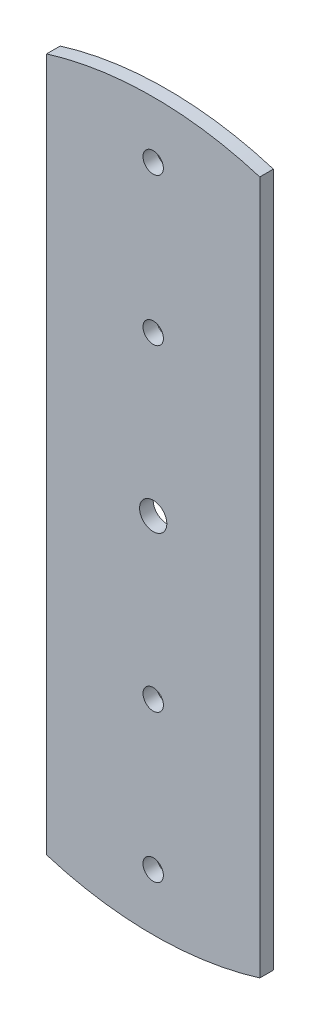
ISO-10303-21;
HEADER;
FILE_DESCRIPTION(('STEP AP214'),'2;1');
FILE_NAME('part.step','',(''),(''),'','','');
FILE_SCHEMA(('AUTOMOTIVE_DESIGN { 1 0 10303 214 1 1 1 1 }'));
ENDSEC;
DATA;
#1=APPLICATION_CONTEXT('core data for automotive mechanical design processes');
#2=APPLICATION_PROTOCOL_DEFINITION('international standard','automotive_design',2000,#1);
#3=PRODUCT_CONTEXT('',#1,'mechanical');
#4=PRODUCT('Part','Part','',(#3));
#5=PRODUCT_RELATED_PRODUCT_CATEGORY('part','',(#4));
#6=PRODUCT_DEFINITION_FORMATION('','',#4);
#7=PRODUCT_DEFINITION_CONTEXT('part definition',#1,'design');
#8=PRODUCT_DEFINITION('design','',#6,#7);
#9=PRODUCT_DEFINITION_SHAPE('','',#8);
#10=(LENGTH_UNIT() NAMED_UNIT(*) SI_UNIT(.MILLI.,.METRE.));
#11=(NAMED_UNIT(*) PLANE_ANGLE_UNIT() SI_UNIT($,.RADIAN.));
#12=(NAMED_UNIT(*) SI_UNIT($,.STERADIAN.) SOLID_ANGLE_UNIT());
#13=UNCERTAINTY_MEASURE_WITH_UNIT(LENGTH_MEASURE(1.E-05),#10,'distance_accuracy_value','');
#14=(GEOMETRIC_REPRESENTATION_CONTEXT(3) GLOBAL_UNCERTAINTY_ASSIGNED_CONTEXT((#13)) GLOBAL_UNIT_ASSIGNED_CONTEXT((#10,
#11,#12)) REPRESENTATION_CONTEXT('',''));
#15=CARTESIAN_POINT('',(0.,0.,0.));
#16=DIRECTION('',(0.,0.,1.));
#17=DIRECTION('',(1.,0.,0.));
#18=AXIS2_PLACEMENT_3D('',#15,#16,#17);
#19=CARTESIAN_POINT('',(0.,0.,6.));
#20=DIRECTION('',(0.,0.,1.));
#21=DIRECTION('',(1.,0.,0.));
#22=AXIS2_PLACEMENT_3D('',#19,#20,#21);
#23=PLANE('',#22);
#24=CARTESIAN_POINT('',(0.,135.,6.));
#25=DIRECTION('',(0.,0.,1.));
#26=DIRECTION('',(1.,0.,0.));
#27=AXIS2_PLACEMENT_3D('',#24,#25,#26);
#28=CIRCLE('',#27,4.5);
#29=CARTESIAN_POINT('',(4.5,135.,6.));
#30=VERTEX_POINT('',#29);
#31=EDGE_CURVE('E131',#30,#30,#28,.T.);
#32=ORIENTED_EDGE('',*,*,#31,.F.);
#33=EDGE_LOOP('',(#32));
#34=FACE_BOUND('',#33,.T.);
#35=CARTESIAN_POINT('',(0.,-70.,6.));
#36=DIRECTION('',(0.,0.,1.));
#37=DIRECTION('',(1.,0.,0.));
#38=AXIS2_PLACEMENT_3D('',#35,#36,#37);
#39=CIRCLE('',#38,4.5);
#40=CARTESIAN_POINT('',(4.5,-70.,6.));
#41=VERTEX_POINT('',#40);
#42=EDGE_CURVE('E119',#41,#41,#39,.T.);
#43=ORIENTED_EDGE('',*,*,#42,.F.);
#44=EDGE_LOOP('',(#43));
#45=FACE_BOUND('',#44,.T.);
#46=CARTESIAN_POINT('',(0.,0.,6.));
#47=DIRECTION('',(0.,0.,1.));
#48=DIRECTION('',(1.,0.,0.));
#49=AXIS2_PLACEMENT_3D('',#46,#47,#48);
#50=CIRCLE('',#49,160.);
#51=CARTESIAN_POINT('',(-47.,-152.941165158371,6.));
#52=VERTEX_POINT('',#51);
#53=CARTESIAN_POINT('',(47.,-152.94116515837,6.));
#54=VERTEX_POINT('',#53);
#55=EDGE_CURVE('E89',#52,#54,#50,.T.);
#56=ORIENTED_EDGE('',*,*,#55,.T.);
#57=DIRECTION('',(0.,1.,0.));
#58=VECTOR('',#57,1.);
#59=CARTESIAN_POINT('',(47.,152.94116515837,6.));
#60=LINE('',#59,#58);
#61=CARTESIAN_POINT('',(47.,152.94116515837,6.));
#62=VERTEX_POINT('',#61);
#63=EDGE_CURVE('E84',#54,#62,#60,.T.);
#64=ORIENTED_EDGE('',*,*,#63,.T.);
#65=CARTESIAN_POINT('',(0.,0.,6.));
#66=DIRECTION('',(0.,0.,1.));
#67=DIRECTION('',(1.,0.,0.));
#68=AXIS2_PLACEMENT_3D('',#65,#66,#67);
#69=CIRCLE('',#68,160.);
#70=CARTESIAN_POINT('',(-47.,152.941165158371,6.));
#71=VERTEX_POINT('',#70);
#72=EDGE_CURVE('E87',#62,#71,#69,.T.);
#73=ORIENTED_EDGE('',*,*,#72,.T.);
#74=DIRECTION('',(0.,-1.,0.));
#75=VECTOR('',#74,1.);
#76=CARTESIAN_POINT('',(-47.,152.941165158371,6.));
#77=LINE('',#76,#75);
#78=EDGE_CURVE('E54',#71,#52,#77,.T.);
#79=ORIENTED_EDGE('',*,*,#78,.T.);
#80=EDGE_LOOP('',(#56,#64,#73,#79));
#81=FACE_BOUND('',#80,.T.);
#82=CARTESIAN_POINT('',(0.,0.,6.));
#83=DIRECTION('',(0.,0.,1.));
#84=DIRECTION('',(1.,0.,0.));
#85=AXIS2_PLACEMENT_3D('',#82,#83,#84);
#86=CIRCLE('',#85,6.);
#87=CARTESIAN_POINT('',(6.,0.,6.));
#88=VERTEX_POINT('',#87);
#89=EDGE_CURVE('E104',#88,#88,#86,.T.);
#90=ORIENTED_EDGE('',*,*,#89,.F.);
#91=EDGE_LOOP('',(#90));
#92=FACE_BOUND('',#91,.T.);
#93=CARTESIAN_POINT('',(0.,70.,6.));
#94=DIRECTION('',(0.,0.,1.));
#95=DIRECTION('',(1.,0.,0.));
#96=AXIS2_PLACEMENT_3D('',#93,#94,#95);
#97=CIRCLE('',#96,4.5);
#98=CARTESIAN_POINT('',(4.5,70.,6.));
#99=VERTEX_POINT('',#98);
#100=EDGE_CURVE('E125',#99,#99,#97,.T.);
#101=ORIENTED_EDGE('',*,*,#100,.F.);
#102=EDGE_LOOP('',(#101));
#103=FACE_BOUND('',#102,.T.);
#104=CARTESIAN_POINT('',(0.,-135.,6.));
#105=DIRECTION('',(0.,0.,1.));
#106=DIRECTION('',(1.,0.,0.));
#107=AXIS2_PLACEMENT_3D('',#104,#105,#106);
#108=CIRCLE('',#107,4.5);
#109=CARTESIAN_POINT('',(4.5,-135.,6.));
#110=VERTEX_POINT('',#109);
#111=EDGE_CURVE('E137',#110,#110,#108,.T.);
#112=ORIENTED_EDGE('',*,*,#111,.F.);
#113=EDGE_LOOP('',(#112));
#114=FACE_BOUND('',#113,.T.);
#115=ADVANCED_FACE('F37',(#34,#45,#81,#92,#103,#114),#23,.T.);
#116=CARTESIAN_POINT('',(0.,0.,0.));
#117=DIRECTION('',(0.,0.,1.));
#118=DIRECTION('',(1.,0.,0.));
#119=AXIS2_PLACEMENT_3D('',#116,#117,#118);
#120=PLANE('',#119);
#121=CARTESIAN_POINT('',(0.,0.,0.));
#122=DIRECTION('',(0.,0.,1.));
#123=DIRECTION('',(1.,0.,0.));
#124=AXIS2_PLACEMENT_3D('',#121,#122,#123);
#125=CIRCLE('',#124,160.);
#126=CARTESIAN_POINT('',(-47.,-152.941165158371,0.));
#127=VERTEX_POINT('',#126);
#128=CARTESIAN_POINT('',(47.,-152.94116515837,0.));
#129=VERTEX_POINT('',#128);
#130=EDGE_CURVE('E101',#127,#129,#125,.T.);
#131=ORIENTED_EDGE('',*,*,#130,.F.);
#132=DIRECTION('',(0.,-1.,0.));
#133=VECTOR('',#132,1.);
#134=CARTESIAN_POINT('',(-47.,152.941165158371,0.));
#135=LINE('',#134,#133);
#136=CARTESIAN_POINT('',(-47.,152.941165158371,0.));
#137=VERTEX_POINT('',#136);
#138=EDGE_CURVE('E77',#137,#127,#135,.T.);
#139=ORIENTED_EDGE('',*,*,#138,.F.);
#140=CARTESIAN_POINT('',(0.,0.,0.));
#141=DIRECTION('',(0.,0.,1.));
#142=DIRECTION('',(1.,0.,0.));
#143=AXIS2_PLACEMENT_3D('',#140,#141,#142);
#144=CIRCLE('',#143,160.);
#145=CARTESIAN_POINT('',(47.,152.94116515837,0.));
#146=VERTEX_POINT('',#145);
#147=EDGE_CURVE('E71',#146,#137,#144,.T.);
#148=ORIENTED_EDGE('',*,*,#147,.F.);
#149=DIRECTION('',(0.,1.,0.));
#150=VECTOR('',#149,1.);
#151=CARTESIAN_POINT('',(47.,152.94116515837,0.));
#152=LINE('',#151,#150);
#153=EDGE_CURVE('E93',#129,#146,#152,.T.);
#154=ORIENTED_EDGE('',*,*,#153,.F.);
#155=EDGE_LOOP('',(#131,#139,#148,#154));
#156=FACE_BOUND('',#155,.T.);
#157=CARTESIAN_POINT('',(0.,0.,0.));
#158=DIRECTION('',(0.,0.,1.));
#159=DIRECTION('',(1.,0.,0.));
#160=AXIS2_PLACEMENT_3D('',#157,#158,#159);
#161=CIRCLE('',#160,6.);
#162=CARTESIAN_POINT('',(6.,0.,0.));
#163=VERTEX_POINT('',#162);
#164=EDGE_CURVE('E116',#163,#163,#161,.T.);
#165=ORIENTED_EDGE('',*,*,#164,.T.);
#166=EDGE_LOOP('',(#165));
#167=FACE_BOUND('',#166,.T.);
#168=CARTESIAN_POINT('',(0.,-70.,0.));
#169=DIRECTION('',(0.,0.,1.));
#170=DIRECTION('',(1.,0.,0.));
#171=AXIS2_PLACEMENT_3D('',#168,#169,#170);
#172=CIRCLE('',#171,4.5);
#173=CARTESIAN_POINT('',(4.5,-70.,0.));
#174=VERTEX_POINT('',#173);
#175=EDGE_CURVE('E122',#174,#174,#172,.T.);
#176=ORIENTED_EDGE('',*,*,#175,.T.);
#177=EDGE_LOOP('',(#176));
#178=FACE_BOUND('',#177,.T.);
#179=CARTESIAN_POINT('',(0.,70.,0.));
#180=DIRECTION('',(0.,0.,1.));
#181=DIRECTION('',(1.,0.,0.));
#182=AXIS2_PLACEMENT_3D('',#179,#180,#181);
#183=CIRCLE('',#182,4.5);
#184=CARTESIAN_POINT('',(4.5,70.,0.));
#185=VERTEX_POINT('',#184);
#186=EDGE_CURVE('E128',#185,#185,#183,.T.);
#187=ORIENTED_EDGE('',*,*,#186,.T.);
#188=EDGE_LOOP('',(#187));
#189=FACE_BOUND('',#188,.T.);
#190=CARTESIAN_POINT('',(0.,135.,0.));
#191=DIRECTION('',(0.,0.,1.));
#192=DIRECTION('',(1.,0.,0.));
#193=AXIS2_PLACEMENT_3D('',#190,#191,#192);
#194=CIRCLE('',#193,4.5);
#195=CARTESIAN_POINT('',(4.5,135.,0.));
#196=VERTEX_POINT('',#195);
#197=EDGE_CURVE('E134',#196,#196,#194,.T.);
#198=ORIENTED_EDGE('',*,*,#197,.T.);
#199=EDGE_LOOP('',(#198));
#200=FACE_BOUND('',#199,.T.);
#201=CARTESIAN_POINT('',(0.,-135.,0.));
#202=DIRECTION('',(0.,0.,1.));
#203=DIRECTION('',(1.,0.,0.));
#204=AXIS2_PLACEMENT_3D('',#201,#202,#203);
#205=CIRCLE('',#204,4.5);
#206=CARTESIAN_POINT('',(4.5,-135.,0.));
#207=VERTEX_POINT('',#206);
#208=EDGE_CURVE('E140',#207,#207,#205,.T.);
#209=ORIENTED_EDGE('',*,*,#208,.T.);
#210=EDGE_LOOP('',(#209));
#211=FACE_BOUND('',#210,.T.);
#212=ADVANCED_FACE('F112',(#156,#167,#178,#189,#200,#211),#120,.F.);
#213=CARTESIAN_POINT('',(0.,0.,6.));
#214=DIRECTION('',(0.,0.,-1.));
#215=DIRECTION('',(-1.,0.,0.));
#216=AXIS2_PLACEMENT_3D('',#213,#214,#215);
#217=CYLINDRICAL_SURFACE('',#216,160.);
#218=ORIENTED_EDGE('',*,*,#130,.T.);
#219=DIRECTION('',(0.,0.,-1.));
#220=VECTOR('',#219,1.);
#221=CARTESIAN_POINT('',(47.,-152.94116515837,6.));
#222=LINE('',#221,#220);
#223=EDGE_CURVE('E11',#54,#129,#222,.T.);
#224=ORIENTED_EDGE('',*,*,#223,.F.);
#225=ORIENTED_EDGE('',*,*,#55,.F.);
#226=DIRECTION('',(0.,0.,-1.));
#227=VECTOR('',#226,1.);
#228=CARTESIAN_POINT('',(-47.,-152.941165158371,6.));
#229=LINE('',#228,#227);
#230=EDGE_CURVE('E97',#52,#127,#229,.T.);
#231=ORIENTED_EDGE('',*,*,#230,.T.);
#232=EDGE_LOOP('',(#218,#224,#225,#231));
#233=FACE_BOUND('',#232,.T.);
#234=ADVANCED_FACE('F39',(#233),#217,.T.);
#235=CARTESIAN_POINT('',(47.,152.94116515837,6.));
#236=DIRECTION('',(-1.,0.,0.));
#237=DIRECTION('',(0.,-1.,0.));
#238=AXIS2_PLACEMENT_3D('',#235,#236,#237);
#239=PLANE('',#238);
#240=ORIENTED_EDGE('',*,*,#153,.T.);
#241=DIRECTION('',(0.,0.,-1.));
#242=VECTOR('',#241,1.);
#243=CARTESIAN_POINT('',(47.,152.94116515837,6.));
#244=LINE('',#243,#242);
#245=EDGE_CURVE('E46',#62,#146,#244,.T.);
#246=ORIENTED_EDGE('',*,*,#245,.F.);
#247=ORIENTED_EDGE('',*,*,#63,.F.);
#248=ORIENTED_EDGE('',*,*,#223,.T.);
#249=EDGE_LOOP('',(#240,#246,#247,#248));
#250=FACE_BOUND('',#249,.T.);
#251=ADVANCED_FACE('F92',(#250),#239,.F.);
#252=CARTESIAN_POINT('',(0.,0.,6.));
#253=DIRECTION('',(0.,0.,-1.));
#254=DIRECTION('',(-1.,0.,0.));
#255=AXIS2_PLACEMENT_3D('',#252,#253,#254);
#256=CYLINDRICAL_SURFACE('',#255,160.);
#257=ORIENTED_EDGE('',*,*,#147,.T.);
#258=DIRECTION('',(0.,0.,-1.));
#259=VECTOR('',#258,1.);
#260=CARTESIAN_POINT('',(-47.,152.941165158371,6.));
#261=LINE('',#260,#259);
#262=EDGE_CURVE('E94',#71,#137,#261,.T.);
#263=ORIENTED_EDGE('',*,*,#262,.F.);
#264=ORIENTED_EDGE('',*,*,#72,.F.);
#265=ORIENTED_EDGE('',*,*,#245,.T.);
#266=EDGE_LOOP('',(#257,#263,#264,#265));
#267=FACE_BOUND('',#266,.T.);
#268=ADVANCED_FACE('F95',(#267),#256,.T.);
#269=CARTESIAN_POINT('',(-47.,152.941165158371,6.));
#270=DIRECTION('',(1.,0.,0.));
#271=DIRECTION('',(0.,1.,0.));
#272=AXIS2_PLACEMENT_3D('',#269,#270,#271);
#273=PLANE('',#272);
#274=ORIENTED_EDGE('',*,*,#138,.T.);
#275=ORIENTED_EDGE('',*,*,#230,.F.);
#276=ORIENTED_EDGE('',*,*,#78,.F.);
#277=ORIENTED_EDGE('',*,*,#262,.T.);
#278=EDGE_LOOP('',(#274,#275,#276,#277));
#279=FACE_BOUND('',#278,.T.);
#280=ADVANCED_FACE('F109',(#279),#273,.F.);
#281=CARTESIAN_POINT('',(0.,0.,6.));
#282=DIRECTION('',(0.,0.,-1.));
#283=DIRECTION('',(-1.,0.,0.));
#284=AXIS2_PLACEMENT_3D('',#281,#282,#283);
#285=CYLINDRICAL_SURFACE('',#284,6.);
#286=ORIENTED_EDGE('',*,*,#89,.T.);
#287=EDGE_LOOP('',(#286));
#288=FACE_BOUND('',#287,.T.);
#289=ORIENTED_EDGE('',*,*,#164,.F.);
#290=EDGE_LOOP('',(#289));
#291=FACE_BOUND('',#290,.T.);
#292=ADVANCED_FACE('F159',(#288,#291),#285,.F.);
#293=CARTESIAN_POINT('',(0.,-70.,6.));
#294=DIRECTION('',(0.,0.,-1.));
#295=DIRECTION('',(-1.,0.,0.));
#296=AXIS2_PLACEMENT_3D('',#293,#294,#295);
#297=CYLINDRICAL_SURFACE('',#296,4.5);
#298=ORIENTED_EDGE('',*,*,#42,.T.);
#299=EDGE_LOOP('',(#298));
#300=FACE_BOUND('',#299,.T.);
#301=ORIENTED_EDGE('',*,*,#175,.F.);
#302=EDGE_LOOP('',(#301));
#303=FACE_BOUND('',#302,.T.);
#304=ADVANCED_FACE('F205',(#300,#303),#297,.F.);
#305=CARTESIAN_POINT('',(0.,70.,6.));
#306=DIRECTION('',(0.,0.,-1.));
#307=DIRECTION('',(-1.,0.,0.));
#308=AXIS2_PLACEMENT_3D('',#305,#306,#307);
#309=CYLINDRICAL_SURFACE('',#308,4.5);
#310=ORIENTED_EDGE('',*,*,#100,.T.);
#311=EDGE_LOOP('',(#310));
#312=FACE_BOUND('',#311,.T.);
#313=ORIENTED_EDGE('',*,*,#186,.F.);
#314=EDGE_LOOP('',(#313));
#315=FACE_BOUND('',#314,.T.);
#316=ADVANCED_FACE('F213',(#312,#315),#309,.F.);
#317=CARTESIAN_POINT('',(0.,135.,6.));
#318=DIRECTION('',(0.,0.,-1.));
#319=DIRECTION('',(-1.,0.,0.));
#320=AXIS2_PLACEMENT_3D('',#317,#318,#319);
#321=CYLINDRICAL_SURFACE('',#320,4.5);
#322=ORIENTED_EDGE('',*,*,#31,.T.);
#323=EDGE_LOOP('',(#322));
#324=FACE_BOUND('',#323,.T.);
#325=ORIENTED_EDGE('',*,*,#197,.F.);
#326=EDGE_LOOP('',(#325));
#327=FACE_BOUND('',#326,.T.);
#328=ADVANCED_FACE('F221',(#324,#327),#321,.F.);
#329=CARTESIAN_POINT('',(0.,-135.,6.));
#330=DIRECTION('',(0.,0.,-1.));
#331=DIRECTION('',(-1.,0.,0.));
#332=AXIS2_PLACEMENT_3D('',#329,#330,#331);
#333=CYLINDRICAL_SURFACE('',#332,4.5);
#334=ORIENTED_EDGE('',*,*,#111,.T.);
#335=EDGE_LOOP('',(#334));
#336=FACE_BOUND('',#335,.T.);
#337=ORIENTED_EDGE('',*,*,#208,.F.);
#338=EDGE_LOOP('',(#337));
#339=FACE_BOUND('',#338,.T.);
#340=ADVANCED_FACE('F146',(#336,#339),#333,.F.);
#341=CLOSED_SHELL('',(#115,#212,#234,#251,#268,#280,#292,#304,#316,#328,#340));
#342=MANIFOLD_SOLID_BREP('B2',#341);
#343=ADVANCED_BREP_SHAPE_REPRESENTATION('',(#18,#342),#14);
#344=SHAPE_DEFINITION_REPRESENTATION(#9,#343);
ENDSEC;
END-ISO-10303-21;
